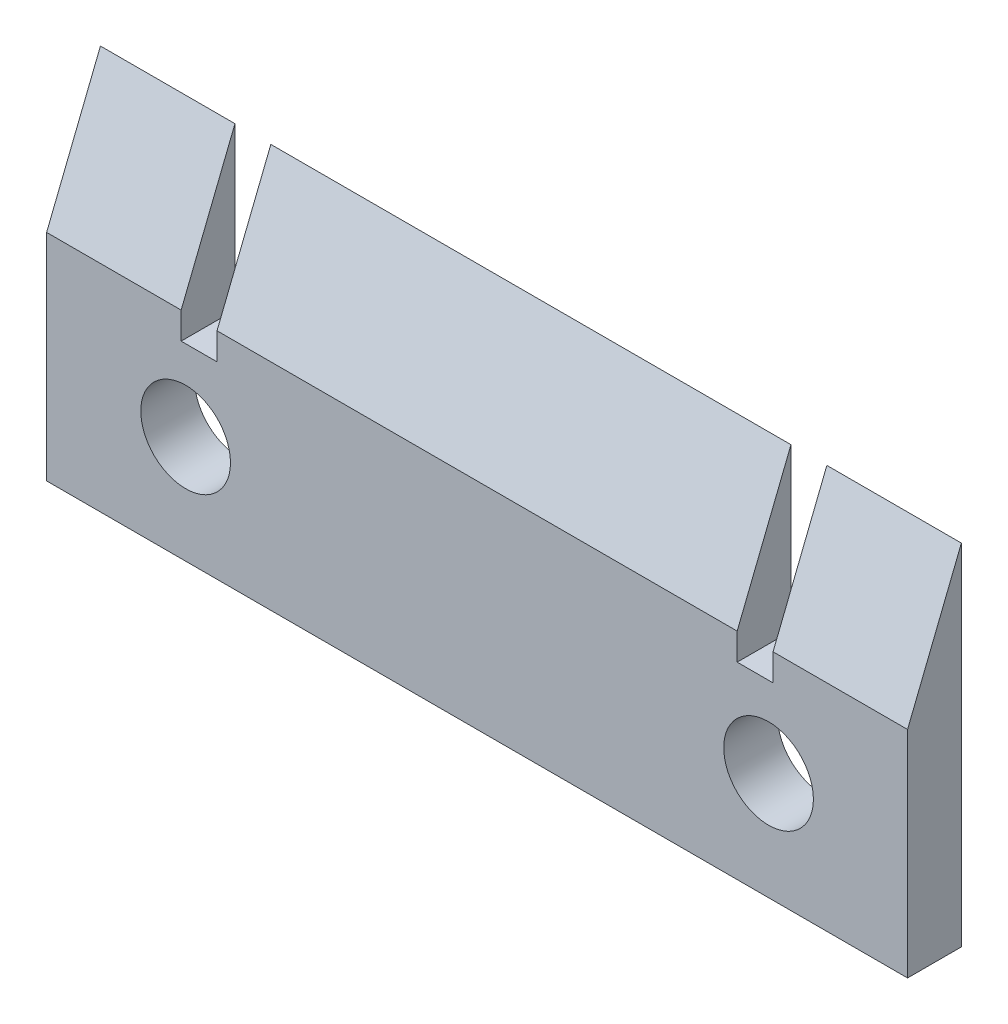
ISO-10303-21;
HEADER;
FILE_DESCRIPTION(('STEP AP214'),'2;1');
FILE_NAME('part.step','',(''),(''),'','','');
FILE_SCHEMA(('AUTOMOTIVE_DESIGN { 1 0 10303 214 1 1 1 1 }'));
ENDSEC;
DATA;
#1=APPLICATION_CONTEXT('core data for automotive mechanical design processes');
#2=APPLICATION_PROTOCOL_DEFINITION('international standard','automotive_design',2000,#1);
#3=PRODUCT_CONTEXT('',#1,'mechanical');
#4=PRODUCT('Part','Part','',(#3));
#5=PRODUCT_RELATED_PRODUCT_CATEGORY('part','',(#4));
#6=PRODUCT_DEFINITION_FORMATION('','',#4);
#7=PRODUCT_DEFINITION_CONTEXT('part definition',#1,'design');
#8=PRODUCT_DEFINITION('design','',#6,#7);
#9=PRODUCT_DEFINITION_SHAPE('','',#8);
#10=(LENGTH_UNIT() NAMED_UNIT(*) SI_UNIT(.MILLI.,.METRE.));
#11=(NAMED_UNIT(*) PLANE_ANGLE_UNIT() SI_UNIT($,.RADIAN.));
#12=(NAMED_UNIT(*) SI_UNIT($,.STERADIAN.) SOLID_ANGLE_UNIT());
#13=UNCERTAINTY_MEASURE_WITH_UNIT(LENGTH_MEASURE(1.E-05),#10,'distance_accuracy_value','');
#14=(GEOMETRIC_REPRESENTATION_CONTEXT(3) GLOBAL_UNCERTAINTY_ASSIGNED_CONTEXT((#13)) GLOBAL_UNIT_ASSIGNED_CONTEXT((#10,
#11,#12)) REPRESENTATION_CONTEXT('',''));
#15=CARTESIAN_POINT('',(0.,0.,0.));
#16=DIRECTION('',(0.,0.,1.));
#17=DIRECTION('',(1.,0.,0.));
#18=AXIS2_PLACEMENT_3D('',#15,#16,#17);
#19=CARTESIAN_POINT('',(177.741329190046,24.,6.));
#20=DIRECTION('',(0.,0.371390676354104,0.92847669088526));
#21=DIRECTION('',(0.,-0.92847669088526,0.371390676354104));
#22=AXIS2_PLACEMENT_3D('',#19,#20,#21);
#23=PLANE('',#22);
#24=DIRECTION('',(-1.,0.,0.));
#25=VECTOR('',#24,1.);
#26=CARTESIAN_POINT('',(-48.,39.,0.));
#27=LINE('',#26,#25);
#28=CARTESIAN_POINT('',(48.,39.,0.));
#29=VERTEX_POINT('',#28);
#30=CARTESIAN_POINT('',(33.,39.,0.));
#31=VERTEX_POINT('',#30);
#32=EDGE_CURVE('E148',#29,#31,#27,.T.);
#33=ORIENTED_EDGE('',*,*,#32,.T.);
#34=DIRECTION('',(0.,-0.92847669088526,0.371390676354104));
#35=VECTOR('',#34,1.);
#36=CARTESIAN_POINT('',(33.,24.,6.00000000000001));
#37=LINE('',#36,#35);
#38=CARTESIAN_POINT('',(33.,24.,6.));
#39=VERTEX_POINT('',#38);
#40=EDGE_CURVE('E132',#31,#39,#37,.T.);
#41=ORIENTED_EDGE('',*,*,#40,.T.);
#42=DIRECTION('',(-1.,0.,0.));
#43=VECTOR('',#42,1.);
#44=CARTESIAN_POINT('',(177.741329190046,24.,6.));
#45=LINE('',#44,#43);
#46=CARTESIAN_POINT('',(48.,24.,6.));
#47=VERTEX_POINT('',#46);
#48=EDGE_CURVE('E171',#47,#39,#45,.T.);
#49=ORIENTED_EDGE('',*,*,#48,.F.);
#50=DIRECTION('',(0.,0.92847669088526,-0.371390676354104));
#51=VECTOR('',#50,1.);
#52=CARTESIAN_POINT('',(48.,36.9310344827586,0.82758620689655));
#53=LINE('',#52,#51);
#54=EDGE_CURVE('E155',#47,#29,#53,.T.);
#55=ORIENTED_EDGE('',*,*,#54,.T.);
#56=EDGE_LOOP('',(#33,#41,#49,#55));
#57=FACE_BOUND('',#56,.T.);
#58=ADVANCED_FACE('F41',(#57),#23,.T.);
#59=CARTESIAN_POINT('',(0.,0.,6.));
#60=DIRECTION('',(0.,0.,1.));
#61=DIRECTION('',(1.,0.,0.));
#62=AXIS2_PLACEMENT_3D('',#59,#60,#61);
#63=PLANE('',#62);
#64=CARTESIAN_POINT('',(32.5,12.,6.));
#65=DIRECTION('',(0.,0.,1.));
#66=DIRECTION('',(1.,0.,0.));
#67=AXIS2_PLACEMENT_3D('',#64,#65,#66);
#68=CIRCLE('',#67,5.);
#69=CARTESIAN_POINT('',(37.5,12.,6.));
#70=VERTEX_POINT('',#69);
#71=EDGE_CURVE('E222',#70,#70,#68,.T.);
#72=ORIENTED_EDGE('',*,*,#71,.F.);
#73=EDGE_LOOP('',(#72));
#74=FACE_BOUND('',#73,.T.);
#75=CARTESIAN_POINT('',(-32.5,12.,6.));
#76=DIRECTION('',(0.,0.,1.));
#77=DIRECTION('',(1.,0.,0.));
#78=AXIS2_PLACEMENT_3D('',#75,#76,#77);
#79=CIRCLE('',#78,5.);
#80=CARTESIAN_POINT('',(-27.5,12.,6.));
#81=VERTEX_POINT('',#80);
#82=EDGE_CURVE('E219',#81,#81,#79,.T.);
#83=ORIENTED_EDGE('',*,*,#82,.F.);
#84=EDGE_LOOP('',(#83));
#85=FACE_BOUND('',#84,.T.);
#86=ORIENTED_EDGE('',*,*,#48,.T.);
#87=DIRECTION('',(0.,-1.,0.));
#88=VECTOR('',#87,1.);
#89=CARTESIAN_POINT('',(33.,0.,6.));
#90=LINE('',#89,#88);
#91=CARTESIAN_POINT('',(33.,21.,6.));
#92=VERTEX_POINT('',#91);
#93=EDGE_CURVE('E138',#39,#92,#90,.T.);
#94=ORIENTED_EDGE('',*,*,#93,.T.);
#95=DIRECTION('',(1.,0.,0.));
#96=VECTOR('',#95,1.);
#97=CARTESIAN_POINT('',(0.,21.,6.));
#98=LINE('',#97,#96);
#99=CARTESIAN_POINT('',(29.,21.,6.));
#100=VERTEX_POINT('',#99);
#101=EDGE_CURVE('E204',#100,#92,#98,.T.);
#102=ORIENTED_EDGE('',*,*,#101,.F.);
#103=DIRECTION('',(0.,-1.,0.));
#104=VECTOR('',#103,1.);
#105=CARTESIAN_POINT('',(29.,0.,6.));
#106=LINE('',#105,#104);
#107=CARTESIAN_POINT('',(29.,24.,6.));
#108=VERTEX_POINT('',#107);
#109=EDGE_CURVE('E208',#108,#100,#106,.T.);
#110=ORIENTED_EDGE('',*,*,#109,.F.);
#111=CARTESIAN_POINT('',(-29.,24.,6.));
#112=VERTEX_POINT('',#111);
#113=EDGE_CURVE('E64',#108,#112,#45,.T.);
#114=ORIENTED_EDGE('',*,*,#113,.T.);
#115=DIRECTION('',(0.,-1.,0.));
#116=VECTOR('',#115,1.);
#117=CARTESIAN_POINT('',(-29.,0.,6.));
#118=LINE('',#117,#116);
#119=CARTESIAN_POINT('',(-29.,21.,6.));
#120=VERTEX_POINT('',#119);
#121=EDGE_CURVE('E189',#112,#120,#118,.T.);
#122=ORIENTED_EDGE('',*,*,#121,.T.);
#123=DIRECTION('',(-1.,0.,0.));
#124=VECTOR('',#123,1.);
#125=CARTESIAN_POINT('',(0.,21.,6.));
#126=LINE('',#125,#124);
#127=CARTESIAN_POINT('',(-33.,21.,6.));
#128=VERTEX_POINT('',#127);
#129=EDGE_CURVE('E184',#120,#128,#126,.T.);
#130=ORIENTED_EDGE('',*,*,#129,.T.);
#131=DIRECTION('',(0.,-1.,0.));
#132=VECTOR('',#131,1.);
#133=CARTESIAN_POINT('',(-33.,0.,6.));
#134=LINE('',#133,#132);
#135=CARTESIAN_POINT('',(-33.,24.,6.));
#136=VERTEX_POINT('',#135);
#137=EDGE_CURVE('E187',#136,#128,#134,.T.);
#138=ORIENTED_EDGE('',*,*,#137,.F.);
#139=CARTESIAN_POINT('',(-48.,24.,6.));
#140=VERTEX_POINT('',#139);
#141=EDGE_CURVE('E183',#136,#140,#45,.T.);
#142=ORIENTED_EDGE('',*,*,#141,.T.);
#143=DIRECTION('',(0.,-1.,0.));
#144=VECTOR('',#143,1.);
#145=CARTESIAN_POINT('',(-48.,39.,6.));
#146=LINE('',#145,#144);
#147=CARTESIAN_POINT('',(-48.,0.,6.));
#148=VERTEX_POINT('',#147);
#149=EDGE_CURVE('E177',#140,#148,#146,.T.);
#150=ORIENTED_EDGE('',*,*,#149,.T.);
#151=DIRECTION('',(1.,0.,0.));
#152=VECTOR('',#151,1.);
#153=CARTESIAN_POINT('',(-48.,0.,6.));
#154=LINE('',#153,#152);
#155=CARTESIAN_POINT('',(48.,0.,6.));
#156=VERTEX_POINT('',#155);
#157=EDGE_CURVE('E174',#148,#156,#154,.T.);
#158=ORIENTED_EDGE('',*,*,#157,.T.);
#159=DIRECTION('',(0.,1.,0.));
#160=VECTOR('',#159,1.);
#161=CARTESIAN_POINT('',(48.,39.,6.));
#162=LINE('',#161,#160);
#163=EDGE_CURVE('E179',#156,#47,#162,.T.);
#164=ORIENTED_EDGE('',*,*,#163,.T.);
#165=EDGE_LOOP('',(#86,#94,#102,#110,#114,#122,#130,#138,#142,#150,#158,#164));
#166=FACE_BOUND('',#165,.T.);
#167=ADVANCED_FACE('F237',(#74,#85,#166),#63,.T.);
#168=CARTESIAN_POINT('',(0.,0.,0.));
#169=DIRECTION('',(0.,0.,1.));
#170=DIRECTION('',(1.,0.,0.));
#171=AXIS2_PLACEMENT_3D('',#168,#169,#170);
#172=PLANE('',#171);
#173=CARTESIAN_POINT('',(32.5,12.,0.));
#174=DIRECTION('',(0.,0.,1.));
#175=DIRECTION('',(1.,0.,0.));
#176=AXIS2_PLACEMENT_3D('',#173,#174,#175);
#177=CIRCLE('',#176,5.);
#178=CARTESIAN_POINT('',(37.5,12.,0.));
#179=VERTEX_POINT('',#178);
#180=EDGE_CURVE('E152',#179,#179,#177,.T.);
#181=ORIENTED_EDGE('',*,*,#180,.T.);
#182=EDGE_LOOP('',(#181));
#183=FACE_BOUND('',#182,.T.);
#184=CARTESIAN_POINT('',(-32.5,12.,0.));
#185=DIRECTION('',(0.,0.,1.));
#186=DIRECTION('',(1.,0.,0.));
#187=AXIS2_PLACEMENT_3D('',#184,#185,#186);
#188=CIRCLE('',#187,5.);
#189=CARTESIAN_POINT('',(-27.5,12.,0.));
#190=VERTEX_POINT('',#189);
#191=EDGE_CURVE('E216',#190,#190,#188,.T.);
#192=ORIENTED_EDGE('',*,*,#191,.T.);
#193=EDGE_LOOP('',(#192));
#194=FACE_BOUND('',#193,.T.);
#195=DIRECTION('',(0.,-1.,0.));
#196=VECTOR('',#195,1.);
#197=CARTESIAN_POINT('',(33.,39.,0.));
#198=LINE('',#197,#196);
#199=CARTESIAN_POINT('',(33.,21.,0.));
#200=VERTEX_POINT('',#199);
#201=EDGE_CURVE('E136',#31,#200,#198,.T.);
#202=ORIENTED_EDGE('',*,*,#201,.F.);
#203=ORIENTED_EDGE('',*,*,#32,.F.);
#204=DIRECTION('',(0.,1.,0.));
#205=VECTOR('',#204,1.);
#206=CARTESIAN_POINT('',(48.,39.,0.));
#207=LINE('',#206,#205);
#208=CARTESIAN_POINT('',(48.,0.,0.));
#209=VERTEX_POINT('',#208);
#210=EDGE_CURVE('E163',#209,#29,#207,.T.);
#211=ORIENTED_EDGE('',*,*,#210,.F.);
#212=DIRECTION('',(1.,0.,0.));
#213=VECTOR('',#212,1.);
#214=CARTESIAN_POINT('',(-48.,0.,0.));
#215=LINE('',#214,#213);
#216=CARTESIAN_POINT('',(-48.,0.,0.));
#217=VERTEX_POINT('',#216);
#218=EDGE_CURVE('E160',#217,#209,#215,.T.);
#219=ORIENTED_EDGE('',*,*,#218,.F.);
#220=DIRECTION('',(0.,-1.,0.));
#221=VECTOR('',#220,1.);
#222=CARTESIAN_POINT('',(-48.,39.,0.));
#223=LINE('',#222,#221);
#224=CARTESIAN_POINT('',(-48.,39.,0.));
#225=VERTEX_POINT('',#224);
#226=EDGE_CURVE('E156',#225,#217,#223,.T.);
#227=ORIENTED_EDGE('',*,*,#226,.F.);
#228=CARTESIAN_POINT('',(-33.,39.,0.));
#229=VERTEX_POINT('',#228);
#230=EDGE_CURVE('E159',#229,#225,#27,.T.);
#231=ORIENTED_EDGE('',*,*,#230,.F.);
#232=DIRECTION('',(0.,-1.,0.));
#233=VECTOR('',#232,1.);
#234=CARTESIAN_POINT('',(-33.,39.,0.));
#235=LINE('',#234,#233);
#236=CARTESIAN_POINT('',(-33.,21.,0.));
#237=VERTEX_POINT('',#236);
#238=EDGE_CURVE('E143',#229,#237,#235,.T.);
#239=ORIENTED_EDGE('',*,*,#238,.T.);
#240=DIRECTION('',(-1.,0.,0.));
#241=VECTOR('',#240,1.);
#242=CARTESIAN_POINT('',(-29.,21.,0.));
#243=LINE('',#242,#241);
#244=CARTESIAN_POINT('',(-29.,21.,0.));
#245=VERTEX_POINT('',#244);
#246=EDGE_CURVE('E199',#245,#237,#243,.T.);
#247=ORIENTED_EDGE('',*,*,#246,.F.);
#248=DIRECTION('',(0.,1.,0.));
#249=VECTOR('',#248,1.);
#250=CARTESIAN_POINT('',(-29.,39.,0.));
#251=LINE('',#250,#249);
#252=CARTESIAN_POINT('',(-29.,39.,0.));
#253=VERTEX_POINT('',#252);
#254=EDGE_CURVE('E195',#253,#245,#251,.F.);
#255=ORIENTED_EDGE('',*,*,#254,.F.);
#256=CARTESIAN_POINT('',(29.,39.,0.));
#257=VERTEX_POINT('',#256);
#258=EDGE_CURVE('E157',#257,#253,#27,.T.);
#259=ORIENTED_EDGE('',*,*,#258,.F.);
#260=DIRECTION('',(0.,1.,0.));
#261=VECTOR('',#260,1.);
#262=CARTESIAN_POINT('',(29.,39.,0.));
#263=LINE('',#262,#261);
#264=CARTESIAN_POINT('',(29.,21.,0.));
#265=VERTEX_POINT('',#264);
#266=EDGE_CURVE('E151',#257,#265,#263,.F.);
#267=ORIENTED_EDGE('',*,*,#266,.T.);
#268=DIRECTION('',(1.,0.,0.));
#269=VECTOR('',#268,1.);
#270=CARTESIAN_POINT('',(29.,21.,0.));
#271=LINE('',#270,#269);
#272=EDGE_CURVE('E56',#265,#200,#271,.T.);
#273=ORIENTED_EDGE('',*,*,#272,.T.);
#274=EDGE_LOOP('',(#202,#203,#211,#219,#227,#231,#239,#247,#255,#259,#267,#273));
#275=FACE_BOUND('',#274,.T.);
#276=ADVANCED_FACE('F146',(#183,#194,#275),#172,.F.);
#277=DIRECTION('',(0.,-0.92847669088526,0.371390676354104));
#278=VECTOR('',#277,1.);
#279=CARTESIAN_POINT('',(29.,24.,6.00000000000001));
#280=LINE('',#279,#278);
#281=EDGE_CURVE('E206',#257,#108,#280,.T.);
#282=ORIENTED_EDGE('',*,*,#281,.F.);
#283=ORIENTED_EDGE('',*,*,#258,.T.);
#284=DIRECTION('',(0.,-0.92847669088526,0.371390676354104));
#285=VECTOR('',#284,1.);
#286=CARTESIAN_POINT('',(-29.,24.,6.00000000000001));
#287=LINE('',#286,#285);
#288=EDGE_CURVE('E49',#253,#112,#287,.T.);
#289=ORIENTED_EDGE('',*,*,#288,.T.);
#290=ORIENTED_EDGE('',*,*,#113,.F.);
#291=EDGE_LOOP('',(#282,#283,#289,#290));
#292=FACE_BOUND('',#291,.T.);
#293=ADVANCED_FACE('F260',(#292),#23,.T.);
#294=CARTESIAN_POINT('',(48.,39.,6.));
#295=DIRECTION('',(-1.,0.,0.));
#296=DIRECTION('',(0.,-1.,0.));
#297=AXIS2_PLACEMENT_3D('',#294,#295,#296);
#298=PLANE('',#297);
#299=ORIENTED_EDGE('',*,*,#54,.F.);
#300=ORIENTED_EDGE('',*,*,#163,.F.);
#301=DIRECTION('',(0.,0.,-1.));
#302=VECTOR('',#301,1.);
#303=CARTESIAN_POINT('',(48.,0.,6.));
#304=LINE('',#303,#302);
#305=EDGE_CURVE('E176',#156,#209,#304,.T.);
#306=ORIENTED_EDGE('',*,*,#305,.T.);
#307=ORIENTED_EDGE('',*,*,#210,.T.);
#308=EDGE_LOOP('',(#299,#300,#306,#307));
#309=FACE_BOUND('',#308,.T.);
#310=ADVANCED_FACE('F43',(#309),#298,.F.);
#311=CARTESIAN_POINT('',(-48.,39.,6.));
#312=DIRECTION('',(1.,0.,0.));
#313=DIRECTION('',(0.,1.,0.));
#314=AXIS2_PLACEMENT_3D('',#311,#312,#313);
#315=PLANE('',#314);
#316=DIRECTION('',(0.,-0.92847669088526,0.371390676354104));
#317=VECTOR('',#316,1.);
#318=CARTESIAN_POINT('',(-48.,36.9310344827586,0.827586206896558));
#319=LINE('',#318,#317);
#320=EDGE_CURVE('E255',#225,#140,#319,.T.);
#321=ORIENTED_EDGE('',*,*,#320,.F.);
#322=ORIENTED_EDGE('',*,*,#226,.T.);
#323=DIRECTION('',(0.,0.,-1.));
#324=VECTOR('',#323,1.);
#325=CARTESIAN_POINT('',(-48.,0.,6.));
#326=LINE('',#325,#324);
#327=EDGE_CURVE('E247',#148,#217,#326,.T.);
#328=ORIENTED_EDGE('',*,*,#327,.F.);
#329=ORIENTED_EDGE('',*,*,#149,.F.);
#330=EDGE_LOOP('',(#321,#322,#328,#329));
#331=FACE_BOUND('',#330,.T.);
#332=ADVANCED_FACE('F277',(#331),#315,.F.);
#333=CARTESIAN_POINT('',(-48.,0.,6.));
#334=DIRECTION('',(0.,1.,0.));
#335=DIRECTION('',(-1.,0.,0.));
#336=AXIS2_PLACEMENT_3D('',#333,#334,#335);
#337=PLANE('',#336);
#338=ORIENTED_EDGE('',*,*,#218,.T.);
#339=ORIENTED_EDGE('',*,*,#305,.F.);
#340=ORIENTED_EDGE('',*,*,#157,.F.);
#341=ORIENTED_EDGE('',*,*,#327,.T.);
#342=EDGE_LOOP('',(#338,#339,#340,#341));
#343=FACE_BOUND('',#342,.T.);
#344=ADVANCED_FACE('F279',(#343),#337,.F.);
#345=DIRECTION('',(0.,-0.92847669088526,0.371390676354104));
#346=VECTOR('',#345,1.);
#347=CARTESIAN_POINT('',(-33.,24.,6.00000000000001));
#348=LINE('',#347,#346);
#349=EDGE_CURVE('E11',#229,#136,#348,.T.);
#350=ORIENTED_EDGE('',*,*,#349,.F.);
#351=ORIENTED_EDGE('',*,*,#230,.T.);
#352=ORIENTED_EDGE('',*,*,#320,.T.);
#353=ORIENTED_EDGE('',*,*,#141,.F.);
#354=EDGE_LOOP('',(#350,#351,#352,#353));
#355=FACE_BOUND('',#354,.T.);
#356=ADVANCED_FACE('F275',(#355),#23,.T.);
#357=CARTESIAN_POINT('',(-33.,39.,0.));
#358=DIRECTION('',(-1.,0.,0.));
#359=DIRECTION('',(0.,0.,1.));
#360=AXIS2_PLACEMENT_3D('',#357,#358,#359);
#361=PLANE('',#360);
#362=ORIENTED_EDGE('',*,*,#137,.T.);
#363=DIRECTION('',(0.,0.,1.));
#364=VECTOR('',#363,1.);
#365=CARTESIAN_POINT('',(-33.,21.,0.));
#366=LINE('',#365,#364);
#367=EDGE_CURVE('E192',#237,#128,#366,.T.);
#368=ORIENTED_EDGE('',*,*,#367,.F.);
#369=ORIENTED_EDGE('',*,*,#238,.F.);
#370=ORIENTED_EDGE('',*,*,#349,.T.);
#371=EDGE_LOOP('',(#362,#368,#369,#370));
#372=FACE_BOUND('',#371,.T.);
#373=ADVANCED_FACE('F271',(#372),#361,.F.);
#374=CARTESIAN_POINT('',(-29.,39.,0.));
#375=DIRECTION('',(-1.,0.,0.));
#376=DIRECTION('',(0.,0.,1.));
#377=AXIS2_PLACEMENT_3D('',#374,#375,#376);
#378=PLANE('',#377);
#379=ORIENTED_EDGE('',*,*,#288,.F.);
#380=ORIENTED_EDGE('',*,*,#254,.T.);
#381=DIRECTION('',(0.,0.,1.));
#382=VECTOR('',#381,1.);
#383=CARTESIAN_POINT('',(-29.,21.,0.));
#384=LINE('',#383,#382);
#385=EDGE_CURVE('E191',#245,#120,#384,.T.);
#386=ORIENTED_EDGE('',*,*,#385,.T.);
#387=ORIENTED_EDGE('',*,*,#121,.F.);
#388=EDGE_LOOP('',(#379,#380,#386,#387));
#389=FACE_BOUND('',#388,.T.);
#390=ADVANCED_FACE('F264',(#389),#378,.T.);
#391=CARTESIAN_POINT('',(-29.,21.,0.));
#392=DIRECTION('',(0.,1.,0.));
#393=DIRECTION('',(0.,0.,1.));
#394=AXIS2_PLACEMENT_3D('',#391,#392,#393);
#395=PLANE('',#394);
#396=ORIENTED_EDGE('',*,*,#385,.F.);
#397=ORIENTED_EDGE('',*,*,#246,.T.);
#398=ORIENTED_EDGE('',*,*,#367,.T.);
#399=ORIENTED_EDGE('',*,*,#129,.F.);
#400=EDGE_LOOP('',(#396,#397,#398,#399));
#401=FACE_BOUND('',#400,.T.);
#402=ADVANCED_FACE('F269',(#401),#395,.T.);
#403=CARTESIAN_POINT('',(33.,39.,0.));
#404=DIRECTION('',(-1.,0.,0.));
#405=DIRECTION('',(0.,0.,1.));
#406=AXIS2_PLACEMENT_3D('',#403,#404,#405);
#407=PLANE('',#406);
#408=ORIENTED_EDGE('',*,*,#201,.T.);
#409=DIRECTION('',(0.,0.,1.));
#410=VECTOR('',#409,1.);
#411=CARTESIAN_POINT('',(33.,21.,0.));
#412=LINE('',#411,#410);
#413=EDGE_CURVE('E210',#200,#92,#412,.T.);
#414=ORIENTED_EDGE('',*,*,#413,.T.);
#415=ORIENTED_EDGE('',*,*,#93,.F.);
#416=ORIENTED_EDGE('',*,*,#40,.F.);
#417=EDGE_LOOP('',(#408,#414,#415,#416));
#418=FACE_BOUND('',#417,.T.);
#419=ADVANCED_FACE('F134',(#418),#407,.T.);
#420=CARTESIAN_POINT('',(29.,21.,0.));
#421=DIRECTION('',(0.,-1.,0.));
#422=DIRECTION('',(0.,0.,-1.));
#423=AXIS2_PLACEMENT_3D('',#420,#421,#422);
#424=PLANE('',#423);
#425=ORIENTED_EDGE('',*,*,#101,.T.);
#426=ORIENTED_EDGE('',*,*,#413,.F.);
#427=ORIENTED_EDGE('',*,*,#272,.F.);
#428=DIRECTION('',(0.,0.,1.));
#429=VECTOR('',#428,1.);
#430=CARTESIAN_POINT('',(29.,21.,0.));
#431=LINE('',#430,#429);
#432=EDGE_CURVE('E211',#265,#100,#431,.T.);
#433=ORIENTED_EDGE('',*,*,#432,.T.);
#434=EDGE_LOOP('',(#425,#426,#427,#433));
#435=FACE_BOUND('',#434,.T.);
#436=ADVANCED_FACE('F328',(#435),#424,.F.);
#437=CARTESIAN_POINT('',(29.,39.,0.));
#438=DIRECTION('',(-1.,0.,0.));
#439=DIRECTION('',(0.,0.,1.));
#440=AXIS2_PLACEMENT_3D('',#437,#438,#439);
#441=PLANE('',#440);
#442=ORIENTED_EDGE('',*,*,#281,.T.);
#443=ORIENTED_EDGE('',*,*,#109,.T.);
#444=ORIENTED_EDGE('',*,*,#432,.F.);
#445=ORIENTED_EDGE('',*,*,#266,.F.);
#446=EDGE_LOOP('',(#442,#443,#444,#445));
#447=FACE_BOUND('',#446,.T.);
#448=ADVANCED_FACE('F311',(#447),#441,.F.);
#449=CARTESIAN_POINT('',(-32.5,12.,0.));
#450=DIRECTION('',(0.,0.,1.));
#451=DIRECTION('',(1.,0.,0.));
#452=AXIS2_PLACEMENT_3D('',#449,#450,#451);
#453=CYLINDRICAL_SURFACE('',#452,5.);
#454=ORIENTED_EDGE('',*,*,#191,.F.);
#455=EDGE_LOOP('',(#454));
#456=FACE_BOUND('',#455,.T.);
#457=ORIENTED_EDGE('',*,*,#82,.T.);
#458=EDGE_LOOP('',(#457));
#459=FACE_BOUND('',#458,.T.);
#460=ADVANCED_FACE('F233',(#456,#459),#453,.F.);
#461=CARTESIAN_POINT('',(32.5,12.,0.));
#462=DIRECTION('',(0.,0.,1.));
#463=DIRECTION('',(1.,0.,0.));
#464=AXIS2_PLACEMENT_3D('',#461,#462,#463);
#465=CYLINDRICAL_SURFACE('',#464,5.);
#466=ORIENTED_EDGE('',*,*,#180,.F.);
#467=EDGE_LOOP('',(#466));
#468=FACE_BOUND('',#467,.T.);
#469=ORIENTED_EDGE('',*,*,#71,.T.);
#470=EDGE_LOOP('',(#469));
#471=FACE_BOUND('',#470,.T.);
#472=ADVANCED_FACE('F230',(#468,#471),#465,.F.);
#473=CLOSED_SHELL('',(#58,#167,#276,#293,#310,#332,#344,#356,#373,#390,#402,#419,#436,#448,#460,#472));
#474=MANIFOLD_SOLID_BREP('B2',#473);
#475=ADVANCED_BREP_SHAPE_REPRESENTATION('',(#18,#474),#14);
#476=SHAPE_DEFINITION_REPRESENTATION(#9,#475);
ENDSEC;
END-ISO-10303-21;
